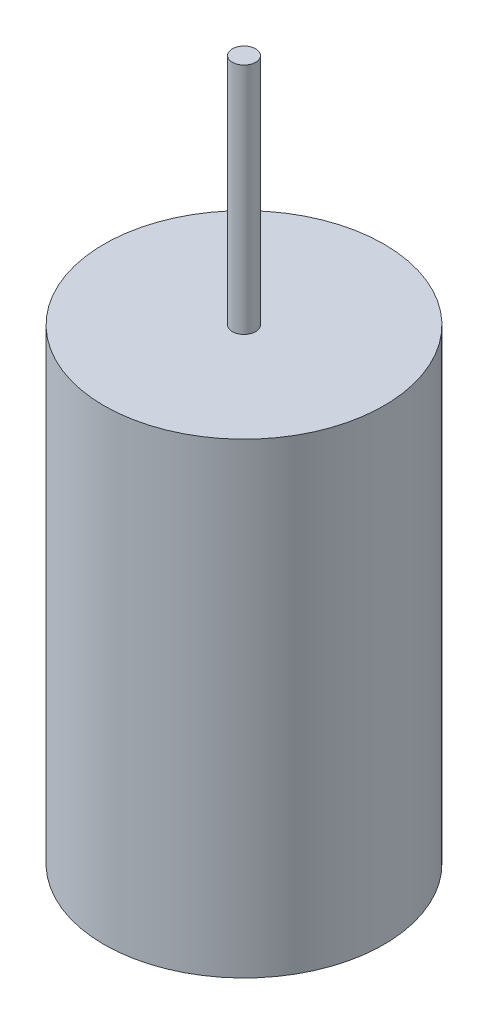
ISO-10303-21;
HEADER;
FILE_DESCRIPTION(('STEP AP214'),'2;1');
FILE_NAME('part.step','',(''),(''),'','','');
FILE_SCHEMA(('AUTOMOTIVE_DESIGN { 1 0 10303 214 1 1 1 1 }'));
ENDSEC;
DATA;
#1=APPLICATION_CONTEXT('core data for automotive mechanical design processes');
#2=APPLICATION_PROTOCOL_DEFINITION('international standard','automotive_design',2000,#1);
#3=PRODUCT_CONTEXT('',#1,'mechanical');
#4=PRODUCT('Part','Part','',(#3));
#5=PRODUCT_RELATED_PRODUCT_CATEGORY('part','',(#4));
#6=PRODUCT_DEFINITION_FORMATION('','',#4);
#7=PRODUCT_DEFINITION_CONTEXT('part definition',#1,'design');
#8=PRODUCT_DEFINITION('design','',#6,#7);
#9=PRODUCT_DEFINITION_SHAPE('','',#8);
#10=(LENGTH_UNIT() NAMED_UNIT(*) SI_UNIT(.MILLI.,.METRE.));
#11=(NAMED_UNIT(*) PLANE_ANGLE_UNIT() SI_UNIT($,.RADIAN.));
#12=(NAMED_UNIT(*) SI_UNIT($,.STERADIAN.) SOLID_ANGLE_UNIT());
#13=UNCERTAINTY_MEASURE_WITH_UNIT(LENGTH_MEASURE(1.E-05),#10,'distance_accuracy_value','');
#14=(GEOMETRIC_REPRESENTATION_CONTEXT(3) GLOBAL_UNCERTAINTY_ASSIGNED_CONTEXT((#13)) GLOBAL_UNIT_ASSIGNED_CONTEXT((#10,
#11,#12)) REPRESENTATION_CONTEXT('',''));
#15=CARTESIAN_POINT('',(0.,0.,0.));
#16=DIRECTION('',(0.,0.,1.));
#17=DIRECTION('',(1.,0.,0.));
#18=AXIS2_PLACEMENT_3D('',#15,#16,#17);
#19=CARTESIAN_POINT('',(0.,10.,0.));
#20=DIRECTION('',(0.,-1.,0.));
#21=DIRECTION('',(0.,0.,-1.));
#22=AXIS2_PLACEMENT_3D('',#19,#20,#21);
#23=CYLINDRICAL_SURFACE('',#22,3.);
#24=CARTESIAN_POINT('',(0.,10.,0.));
#25=DIRECTION('',(0.,1.,0.));
#26=DIRECTION('',(0.,0.,1.));
#27=AXIS2_PLACEMENT_3D('',#24,#25,#26);
#28=CIRCLE('',#27,3.);
#29=CARTESIAN_POINT('',(0.,10.,3.));
#30=VERTEX_POINT('',#29);
#31=EDGE_CURVE('E10',#30,#30,#28,.T.);
#32=ORIENTED_EDGE('',*,*,#31,.F.);
#33=EDGE_LOOP('',(#32));
#34=FACE_BOUND('',#33,.T.);
#35=CARTESIAN_POINT('',(0.,0.,0.));
#36=DIRECTION('',(0.,1.,0.));
#37=DIRECTION('',(0.,0.,1.));
#38=AXIS2_PLACEMENT_3D('',#35,#36,#37);
#39=CIRCLE('',#38,3.);
#40=CARTESIAN_POINT('',(0.,0.,3.));
#41=VERTEX_POINT('',#40);
#42=EDGE_CURVE('E34',#41,#41,#39,.T.);
#43=ORIENTED_EDGE('',*,*,#42,.T.);
#44=EDGE_LOOP('',(#43));
#45=FACE_BOUND('',#44,.T.);
#46=ADVANCED_FACE('F31',(#34,#45),#23,.T.);
#47=CARTESIAN_POINT('',(0.,10.,0.));
#48=DIRECTION('',(0.,1.,0.));
#49=DIRECTION('',(0.,0.,1.));
#50=AXIS2_PLACEMENT_3D('',#47,#48,#49);
#51=PLANE('',#50);
#52=CARTESIAN_POINT('',(0.,10.,0.));
#53=DIRECTION('',(0.,1.,0.));
#54=DIRECTION('',(0.,0.,1.));
#55=AXIS2_PLACEMENT_3D('',#52,#53,#54);
#56=CIRCLE('',#55,0.25);
#57=CARTESIAN_POINT('',(0.,10.,0.25));
#58=VERTEX_POINT('',#57);
#59=EDGE_CURVE('E43',#58,#58,#56,.T.);
#60=ORIENTED_EDGE('',*,*,#59,.F.);
#61=EDGE_LOOP('',(#60));
#62=FACE_BOUND('',#61,.T.);
#63=ORIENTED_EDGE('',*,*,#31,.T.);
#64=EDGE_LOOP('',(#63));
#65=FACE_BOUND('',#64,.T.);
#66=ADVANCED_FACE('F58',(#62,#65),#51,.T.);
#67=CARTESIAN_POINT('',(0.,0.,0.));
#68=DIRECTION('',(0.,1.,0.));
#69=DIRECTION('',(0.,0.,1.));
#70=AXIS2_PLACEMENT_3D('',#67,#68,#69);
#71=PLANE('',#70);
#72=ORIENTED_EDGE('',*,*,#42,.F.);
#73=EDGE_LOOP('',(#72));
#74=FACE_BOUND('',#73,.T.);
#75=ADVANCED_FACE('F54',(#74),#71,.F.);
#76=CARTESIAN_POINT('',(0.,15.,0.));
#77=DIRECTION('',(0.,-1.,0.));
#78=DIRECTION('',(0.,0.,-1.));
#79=AXIS2_PLACEMENT_3D('',#76,#77,#78);
#80=CYLINDRICAL_SURFACE('',#79,0.25);
#81=CARTESIAN_POINT('',(0.,15.,0.));
#82=DIRECTION('',(0.,1.,0.));
#83=DIRECTION('',(0.,0.,1.));
#84=AXIS2_PLACEMENT_3D('',#81,#82,#83);
#85=CIRCLE('',#84,0.25);
#86=CARTESIAN_POINT('',(0.,15.,0.25));
#87=VERTEX_POINT('',#86);
#88=EDGE_CURVE('E41',#87,#87,#85,.T.);
#89=ORIENTED_EDGE('',*,*,#88,.F.);
#90=EDGE_LOOP('',(#89));
#91=FACE_BOUND('',#90,.T.);
#92=ORIENTED_EDGE('',*,*,#59,.T.);
#93=EDGE_LOOP('',(#92));
#94=FACE_BOUND('',#93,.T.);
#95=ADVANCED_FACE('F51',(#91,#94),#80,.T.);
#96=CARTESIAN_POINT('',(0.,15.,0.));
#97=DIRECTION('',(0.,1.,0.));
#98=DIRECTION('',(0.,0.,1.));
#99=AXIS2_PLACEMENT_3D('',#96,#97,#98);
#100=PLANE('',#99);
#101=ORIENTED_EDGE('',*,*,#88,.T.);
#102=EDGE_LOOP('',(#101));
#103=FACE_BOUND('',#102,.T.);
#104=ADVANCED_FACE('F49',(#103),#100,.T.);
#105=CLOSED_SHELL('',(#46,#66,#75,#95,#104));
#106=MANIFOLD_SOLID_BREP('B2',#105);
#107=ADVANCED_BREP_SHAPE_REPRESENTATION('',(#18,#106),#14);
#108=SHAPE_DEFINITION_REPRESENTATION(#9,#107);
ENDSEC;
END-ISO-10303-21;
